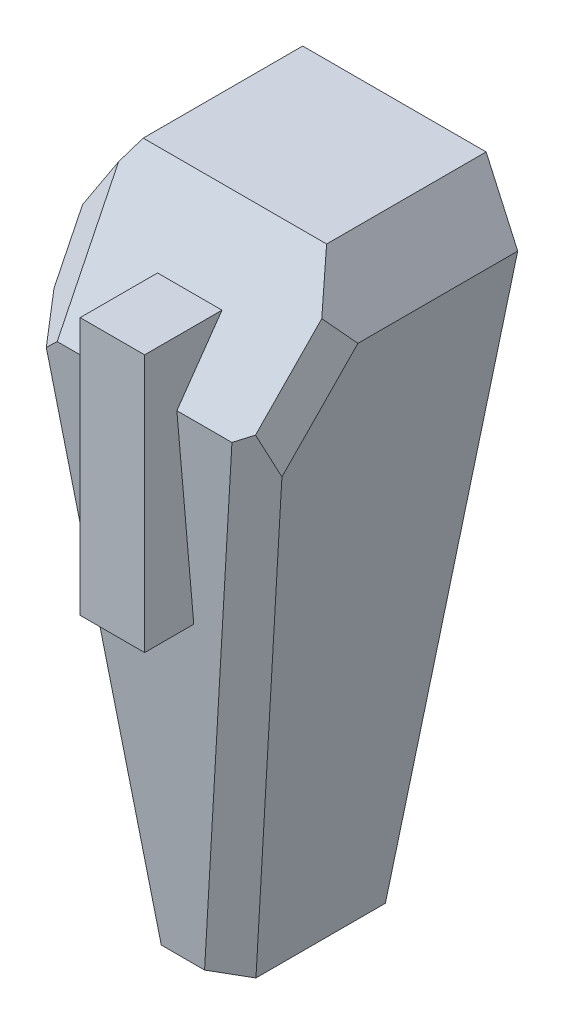
ISO-10303-21;
HEADER;
FILE_DESCRIPTION(('STEP AP214'),'2;1');
FILE_NAME('part.step','',(''),(''),'','','');
FILE_SCHEMA(('AUTOMOTIVE_DESIGN { 1 0 10303 214 1 1 1 1 }'));
ENDSEC;
DATA;
#1=APPLICATION_CONTEXT('core data for automotive mechanical design processes');
#2=APPLICATION_PROTOCOL_DEFINITION('international standard','automotive_design',2000,#1);
#3=PRODUCT_CONTEXT('',#1,'mechanical');
#4=PRODUCT('Part','Part','',(#3));
#5=PRODUCT_RELATED_PRODUCT_CATEGORY('part','',(#4));
#6=PRODUCT_DEFINITION_FORMATION('','',#4);
#7=PRODUCT_DEFINITION_CONTEXT('part definition',#1,'design');
#8=PRODUCT_DEFINITION('design','',#6,#7);
#9=PRODUCT_DEFINITION_SHAPE('','',#8);
#10=(LENGTH_UNIT() NAMED_UNIT(*) SI_UNIT(.MILLI.,.METRE.));
#11=(NAMED_UNIT(*) PLANE_ANGLE_UNIT() SI_UNIT($,.RADIAN.));
#12=(NAMED_UNIT(*) SI_UNIT($,.STERADIAN.) SOLID_ANGLE_UNIT());
#13=UNCERTAINTY_MEASURE_WITH_UNIT(LENGTH_MEASURE(1.E-05),#10,'distance_accuracy_value','');
#14=(GEOMETRIC_REPRESENTATION_CONTEXT(3) GLOBAL_UNCERTAINTY_ASSIGNED_CONTEXT((#13)) GLOBAL_UNIT_ASSIGNED_CONTEXT((#10,
#11,#12)) REPRESENTATION_CONTEXT('',''));
#15=CARTESIAN_POINT('',(0.,0.,0.));
#16=DIRECTION('',(0.,0.,1.));
#17=DIRECTION('',(1.,0.,0.));
#18=AXIS2_PLACEMENT_3D('',#15,#16,#17);
#19=CARTESIAN_POINT('',(-2.54063762490666,-7.57736723879216,12.5731601083553));
#20=DIRECTION('',(0.,1.,0.));
#21=DIRECTION('',(0.,0.,1.));
#22=AXIS2_PLACEMENT_3D('',#19,#20,#21);
#23=PLANE('',#22);
#24=DIRECTION('',(0.,0.,-1.));
#25=VECTOR('',#24,1.);
#26=CARTESIAN_POINT('',(2.27850759703834,-7.57736723879216,12.5731601083553));
#27=LINE('',#26,#25);
#28=CARTESIAN_POINT('',(2.27850759703834,-7.57736723879216,7.99436953583196));
#29=VERTEX_POINT('',#28);
#30=CARTESIAN_POINT('',(2.27850759703834,-7.57736723879216,1.14316010835564));
#31=VERTEX_POINT('',#30);
#32=EDGE_CURVE('E239',#29,#31,#27,.T.);
#33=ORIENTED_EDGE('',*,*,#32,.T.);
#34=DIRECTION('',(1.,0.,0.));
#35=VECTOR('',#34,1.);
#36=CARTESIAN_POINT('',(7.88021715314835,-7.57736723879216,1.14316010835564));
#37=LINE('',#36,#35);
#38=CARTESIAN_POINT('',(7.88021715314835,-7.57736723879216,1.14316010835564));
#39=VERTEX_POINT('',#38);
#40=EDGE_CURVE('E313',#31,#39,#37,.T.);
#41=ORIENTED_EDGE('',*,*,#40,.T.);
#42=DIRECTION('',(0.,0.,1.));
#43=VECTOR('',#42,1.);
#44=CARTESIAN_POINT('',(7.88021715314835,-7.57736723879216,12.5731601083553));
#45=LINE('',#44,#43);
#46=CARTESIAN_POINT('',(7.88021715314835,-7.57736723879216,8.79466521533705));
#47=VERTEX_POINT('',#46);
#48=EDGE_CURVE('E247',#39,#47,#45,.T.);
#49=ORIENTED_EDGE('',*,*,#48,.T.);
#50=DIRECTION('',(0.865779538833403,0.,-0.500425608994404));
#51=VECTOR('',#50,1.);
#52=CARTESIAN_POINT('',(10.1972262094942,-7.57736723879216,7.45542050457639));
#53=LINE('',#52,#51);
#54=CARTESIAN_POINT('',(5.95663715173307,-7.57736723879216,9.90650564408495));
#55=VERTEX_POINT('',#54);
#56=EDGE_CURVE('E309',#47,#55,#53,.F.);
#57=ORIENTED_EDGE('',*,*,#56,.T.);
#58=DIRECTION('',(-1.,0.,0.));
#59=VECTOR('',#58,1.);
#60=CARTESIAN_POINT('',(-2.54063762490666,-7.57736723879216,9.90650564408495));
#61=LINE('',#60,#59);
#62=CARTESIAN_POINT('',(3.39700225036011,-7.57736723879216,9.90650564408495));
#63=VERTEX_POINT('',#62);
#64=EDGE_CURVE('E267',#55,#63,#61,.T.);
#65=ORIENTED_EDGE('',*,*,#64,.T.);
#66=DIRECTION('',(0.504908682278094,0.,0.863172765186784));
#67=VECTOR('',#66,1.);
#68=CARTESIAN_POINT('',(2.2794048278375,-7.57736723879216,7.99590340763315));
#69=LINE('',#68,#67);
#70=EDGE_CURVE('E293',#63,#29,#69,.F.);
#71=ORIENTED_EDGE('',*,*,#70,.T.);
#72=EDGE_LOOP('',(#33,#41,#49,#57,#65,#71));
#73=FACE_BOUND('',#72,.T.);
#74=ADVANCED_FACE('F38',(#73),#23,.F.);
#75=CARTESIAN_POINT('',(-2.54063762490667,30.5226327612078,12.5731601083553));
#76=DIRECTION('',(0.,-1.,0.));
#77=DIRECTION('',(0.,0.,-1.));
#78=AXIS2_PLACEMENT_3D('',#75,#76,#77);
#79=PLANE('',#78);
#80=DIRECTION('',(0.,0.,-1.));
#81=VECTOR('',#80,1.);
#82=CARTESIAN_POINT('',(10.4996578494809,30.5226327612078,12.5731601083553));
#83=LINE('',#82,#81);
#84=CARTESIAN_POINT('',(10.4996578494809,30.5226327612078,7.23757866719735));
#85=VERTEX_POINT('',#84);
#86=CARTESIAN_POINT('',(10.4996578494809,30.5226327612078,-2.19015797198194));
#87=VERTEX_POINT('',#86);
#88=EDGE_CURVE('E254',#85,#87,#83,.T.);
#89=ORIENTED_EDGE('',*,*,#88,.T.);
#90=DIRECTION('',(-1.,0.,0.));
#91=VECTOR('',#90,1.);
#92=CARTESIAN_POINT('',(-2.54063762490666,30.5226327612078,-2.19015797198195));
#93=LINE('',#92,#91);
#94=CARTESIAN_POINT('',(-0.340933099294201,30.5226327612078,-2.19015797198194));
#95=VERTEX_POINT('',#94);
#96=EDGE_CURVE('E322',#87,#95,#93,.T.);
#97=ORIENTED_EDGE('',*,*,#96,.T.);
#98=DIRECTION('',(0.,0.,1.));
#99=VECTOR('',#98,1.);
#100=CARTESIAN_POINT('',(-0.340933099294201,30.5226327612078,12.5731601083553));
#101=LINE('',#100,#99);
#102=CARTESIAN_POINT('',(-0.340933099294201,30.5226327612078,7.23757866719735));
#103=VERTEX_POINT('',#102);
#104=EDGE_CURVE('E249',#95,#103,#101,.T.);
#105=ORIENTED_EDGE('',*,*,#104,.T.);
#106=DIRECTION('',(1.,0.,0.));
#107=VECTOR('',#106,1.);
#108=CARTESIAN_POINT('',(-2.54063762490667,30.5226327612078,7.23757866719735));
#109=LINE('',#108,#107);
#110=EDGE_CURVE('E236',#103,#85,#109,.T.);
#111=ORIENTED_EDGE('',*,*,#110,.T.);
#112=EDGE_LOOP('',(#89,#97,#105,#111));
#113=FACE_BOUND('',#112,.T.);
#114=ADVANCED_FACE('F373',(#113),#79,.F.);
#115=CARTESIAN_POINT('',(-2.54063762490666,22.9026327612078,12.5731601083553));
#116=DIRECTION('',(0.,-0.573576436351044,-0.819152044288994));
#117=DIRECTION('',(-1.,0.,0.));
#118=AXIS2_PLACEMENT_3D('',#115,#116,#117);
#119=PLANE('',#118);
#120=DIRECTION('',(0.776284712506677,0.516379080307432,-0.361572524605059));
#121=VECTOR('',#120,1.);
#122=CARTESIAN_POINT('',(2.53828616746802,17.7792933356468,16.1605609949401));
#123=LINE('',#122,#121);
#124=CARTESIAN_POINT('',(10.2403217934618,22.9026327612078,12.5731601083553));
#125=VERTEX_POINT('',#124);
#126=CARTESIAN_POINT('',(11.1912194604519,23.5351631393487,12.1302575694345));
#127=VERTEX_POINT('',#126);
#128=EDGE_CURVE('E295',#125,#127,#123,.T.);
#129=ORIENTED_EDGE('',*,*,#128,.T.);
#130=DIRECTION('',(-0.114368906493136,-0.813777054443474,0.56981282794341));
#131=VECTOR('',#130,1.);
#132=CARTESIAN_POINT('',(10.9238698199732,21.6328716021958,13.4622564436214));
#133=LINE('',#132,#131);
#134=CARTESIAN_POINT('',(11.8456079068349,28.1913788774204,8.869940210106));
#135=VERTEX_POINT('',#134);
#136=EDGE_CURVE('E299',#127,#135,#133,.F.);
#137=ORIENTED_EDGE('',*,*,#136,.T.);
#138=DIRECTION('',(-0.427535056636436,0.740512440111149,-0.518512392703889));
#139=VECTOR('',#138,1.);
#140=CARTESIAN_POINT('',(11.7113291514032,28.4239565042053,8.70708760261228));
#141=LINE('',#140,#139);
#142=EDGE_CURVE('E257',#135,#85,#141,.T.);
#143=ORIENTED_EDGE('',*,*,#142,.T.);
#144=ORIENTED_EDGE('',*,*,#110,.F.);
#145=DIRECTION('',(-0.427535056636435,-0.740512440111149,0.518512392703889));
#146=VECTOR('',#145,1.);
#147=CARTESIAN_POINT('',(-4.33826646493005,23.5990482771362,12.0855247143761));
#148=LINE('',#147,#146);
#149=CARTESIAN_POINT('',(-0.998458357425136,29.3837656068652,8.0350220336875));
#150=VERTEX_POINT('',#149);
#151=EDGE_CURVE('E251',#103,#150,#148,.T.);
#152=ORIENTED_EDGE('',*,*,#151,.T.);
#153=DIRECTION('',(-0.114368906493137,0.813777054443474,-0.56981282794341));
#154=VECTOR('',#153,1.);
#155=CARTESIAN_POINT('',(-0.119680946406349,23.1309394237868,12.413298062194));
#156=LINE('',#155,#154);
#157=CARTESIAN_POINT('',(-0.087594537479382,22.9026327612078,12.5731601083553));
#158=VERTEX_POINT('',#157);
#159=EDGE_CURVE('E278',#150,#158,#156,.F.);
#160=ORIENTED_EDGE('',*,*,#159,.T.);
#161=DIRECTION('',(-1.,0.,0.));
#162=VECTOR('',#161,1.);
#163=CARTESIAN_POINT('',(-2.54063762490666,22.9026327612078,12.5731601083553));
#164=LINE('',#163,#162);
#165=CARTESIAN_POINT('',(3.17436237509333,22.9026327612078,12.5731601083553));
#166=VERTEX_POINT('',#165);
#167=EDGE_CURVE('E227',#166,#158,#164,.T.);
#168=ORIENTED_EDGE('',*,*,#167,.F.);
#169=DIRECTION('',(0.,0.819152044288994,-0.573576436351044));
#170=VECTOR('',#169,1.);
#171=CARTESIAN_POINT('',(3.17436237509333,22.9026327612078,12.5731601083553));
#172=LINE('',#171,#170);
#173=CARTESIAN_POINT('',(3.17436237509333,26.7126327612078,9.90536938777633));
#174=VERTEX_POINT('',#173);
#175=EDGE_CURVE('E264',#174,#166,#172,.F.);
#176=ORIENTED_EDGE('',*,*,#175,.F.);
#177=DIRECTION('',(-1.,0.,0.));
#178=VECTOR('',#177,1.);
#179=CARTESIAN_POINT('',(-2.54063762490666,26.7126327612078,9.90536938777633));
#180=LINE('',#179,#178);
#181=CARTESIAN_POINT('',(6.98436237509333,26.7126327612078,9.90536938777633));
#182=VERTEX_POINT('',#181);
#183=EDGE_CURVE('E262',#174,#182,#180,.F.);
#184=ORIENTED_EDGE('',*,*,#183,.T.);
#185=DIRECTION('',(0.,-0.819152044288994,0.573576436351044));
#186=VECTOR('',#185,1.);
#187=CARTESIAN_POINT('',(6.98436237509333,22.9026327612078,12.5731601083553));
#188=LINE('',#187,#186);
#189=CARTESIAN_POINT('',(6.98436237509333,22.9026327612078,12.5731601083553));
#190=VERTEX_POINT('',#189);
#191=EDGE_CURVE('E259',#190,#182,#188,.F.);
#192=ORIENTED_EDGE('',*,*,#191,.F.);
#193=EDGE_CURVE('E234',#125,#190,#164,.T.);
#194=ORIENTED_EDGE('',*,*,#193,.F.);
#195=EDGE_LOOP('',(#129,#137,#143,#144,#152,#160,#168,#176,#184,#192,#194));
#196=FACE_BOUND('',#195,.T.);
#197=ADVANCED_FACE('F368',(#196),#119,.F.);
#198=CARTESIAN_POINT('',(2.27850759703834,-7.57736723879216,12.5731601083553));
#199=DIRECTION('',(0.990268068741571,0.139173100960062,0.));
#200=DIRECTION('',(0.,0.,-1.));
#201=AXIS2_PLACEMENT_3D('',#198,#199,#200);
#202=PLANE('',#201);
#203=DIRECTION('',(0.,0.,1.));
#204=VECTOR('',#203,1.);
#205=CARTESIAN_POINT('',(-2.54063762490667,26.7126327612087,12.5731601083553));
#206=LINE('',#205,#204);
#207=CARTESIAN_POINT('',(-2.54063762490667,26.7126327612087,-1.85682616394826));
#208=VERTEX_POINT('',#207);
#209=CARTESIAN_POINT('',(-2.54063762490667,26.7126327612087,8.62203318869436));
#210=VERTEX_POINT('',#209);
#211=EDGE_CURVE('E242',#208,#210,#206,.T.);
#212=ORIENTED_EDGE('',*,*,#211,.F.);
#213=DIRECTION('',(-0.138653705761118,0.986572379869053,-0.0863138989863305));
#214=VECTOR('',#213,1.);
#215=CARTESIAN_POINT('',(2.41529888756279,-8.55068784567572,1.22831462743412));
#216=LINE('',#215,#214);
#217=EDGE_CURVE('E11',#208,#31,#216,.F.);
#218=ORIENTED_EDGE('',*,*,#217,.T.);
#219=ORIENTED_EDGE('',*,*,#32,.F.);
#220=DIRECTION('',(0.138653705761118,-0.986572379869052,-0.0863138989863404));
#221=VECTOR('',#220,1.);
#222=CARTESIAN_POINT('',(2.22370981300887,-7.18746074545517,8.02848193383409));
#223=LINE('',#222,#221);
#224=CARTESIAN_POINT('',(-2.11736758706077,23.7009099495275,10.7308642044317));
#225=VERTEX_POINT('',#224);
#226=EDGE_CURVE('E286',#29,#225,#223,.F.);
#227=ORIENTED_EDGE('',*,*,#226,.T.);
#228=DIRECTION('',(0.114368906493136,-0.813777054443474,0.569812827943411));
#229=VECTOR('',#228,1.);
#230=CARTESIAN_POINT('',(0.971285912954412,1.72399835258292,26.1192633711805));
#231=LINE('',#230,#229);
#232=EDGE_CURVE('E288',#225,#210,#231,.F.);
#233=ORIENTED_EDGE('',*,*,#232,.T.);
#234=EDGE_LOOP('',(#212,#218,#219,#227,#233));
#235=FACE_BOUND('',#234,.T.);
#236=ADVANCED_FACE('F333',(#235),#202,.F.);
#237=CARTESIAN_POINT('',(12.6993623750933,26.7126327612087,12.5731601083553));
#238=DIRECTION('',(-0.990268068741571,0.139173100960062,0.));
#239=DIRECTION('',(0.,0.,-1.));
#240=AXIS2_PLACEMENT_3D('',#237,#238,#239);
#241=PLANE('',#240);
#242=ORIENTED_EDGE('',*,*,#48,.F.);
#243=DIRECTION('',(-0.138653705761118,-0.986572379869053,0.0863138989863305));
#244=VECTOR('',#243,1.);
#245=CARTESIAN_POINT('',(12.526668022999,25.4838485970897,-1.74932147966767));
#246=LINE('',#245,#244);
#247=CARTESIAN_POINT('',(12.6993623750933,26.7126327612087,-1.85682616394826));
#248=VERTEX_POINT('',#247);
#249=EDGE_CURVE('E318',#39,#248,#246,.F.);
#250=ORIENTED_EDGE('',*,*,#249,.T.);
#251=DIRECTION('',(0.,0.,-1.));
#252=VECTOR('',#251,1.);
#253=CARTESIAN_POINT('',(12.6993623750933,26.7126327612087,12.5731601083553));
#254=LINE('',#253,#252);
#255=CARTESIAN_POINT('',(12.6993623750933,26.7126327612087,7.58721521931884));
#256=VERTEX_POINT('',#255);
#257=EDGE_CURVE('E244',#256,#248,#254,.T.);
#258=ORIENTED_EDGE('',*,*,#257,.F.);
#259=DIRECTION('',(0.114368906493136,0.813777054443475,-0.569812827943411));
#260=VECTOR('',#259,1.);
#261=CARTESIAN_POINT('',(12.3744339806048,24.4006471011222,9.20608500674412));
#262=LINE('',#261,#260);
#263=CARTESIAN_POINT('',(11.9486711773902,21.3711873422113,11.3273355666365));
#264=VERTEX_POINT('',#263);
#265=EDGE_CURVE('E307',#256,#264,#262,.F.);
#266=ORIENTED_EDGE('',*,*,#265,.T.);
#267=DIRECTION('',(0.138653705761118,0.986572379869052,0.0863138989863404));
#268=VECTOR('',#267,1.);
#269=CARTESIAN_POINT('',(12.7086793653743,26.7789265917579,11.8004514462761));
#270=LINE('',#269,#268);
#271=EDGE_CURVE('E304',#264,#47,#270,.F.);
#272=ORIENTED_EDGE('',*,*,#271,.T.);
#273=EDGE_LOOP('',(#242,#250,#258,#266,#272));
#274=FACE_BOUND('',#273,.T.);
#275=ADVANCED_FACE('F342',(#274),#241,.F.);
#276=CARTESIAN_POINT('',(-2.54063762490667,26.7126327612078,12.5731601083553));
#277=DIRECTION('',(0.86602540378444,-0.499999999999997,0.));
#278=DIRECTION('',(0.,0.,-1.));
#279=AXIS2_PLACEMENT_3D('',#276,#277,#278);
#280=PLANE('',#279);
#281=ORIENTED_EDGE('',*,*,#104,.F.);
#282=DIRECTION('',(0.498570974847155,0.863550259614425,-0.075550858101128));
#283=VECTOR('',#282,1.);
#284=CARTESIAN_POINT('',(-3.08417862739423,25.7711921289024,-1.77446078123879));
#285=LINE('',#284,#283);
#286=EDGE_CURVE('E46',#95,#208,#285,.F.);
#287=ORIENTED_EDGE('',*,*,#286,.T.);
#288=ORIENTED_EDGE('',*,*,#211,.T.);
#289=DIRECTION('',(0.491183494867127,0.850754768949119,-0.186962823792449));
#290=VECTOR('',#289,1.);
#291=CARTESIAN_POINT('',(-2.90348167352217,26.0841684337818,8.76014521532923));
#292=LINE('',#291,#290);
#293=EDGE_CURVE('E291',#210,#150,#292,.T.);
#294=ORIENTED_EDGE('',*,*,#293,.T.);
#295=ORIENTED_EDGE('',*,*,#151,.F.);
#296=EDGE_LOOP('',(#281,#287,#288,#294,#295));
#297=FACE_BOUND('',#296,.T.);
#298=ADVANCED_FACE('F327',(#297),#280,.F.);
#299=CARTESIAN_POINT('',(10.4996578494809,30.5226327612078,12.5731601083553));
#300=DIRECTION('',(-0.86602540378444,-0.499999999999998,0.));
#301=DIRECTION('',(0.,0.,-1.));
#302=AXIS2_PLACEMENT_3D('',#299,#300,#301);
#303=PLANE('',#302);
#304=ORIENTED_EDGE('',*,*,#257,.T.);
#305=DIRECTION('',(0.498570974847156,-0.863550259614424,0.0755508581011279));
#306=VECTOR('',#305,1.);
#307=CARTESIAN_POINT('',(11.0557546161723,29.5594449073736,-2.10588995392558));
#308=LINE('',#307,#306);
#309=EDGE_CURVE('E320',#248,#87,#308,.F.);
#310=ORIENTED_EDGE('',*,*,#309,.T.);
#311=ORIENTED_EDGE('',*,*,#88,.F.);
#312=ORIENTED_EDGE('',*,*,#142,.F.);
#313=DIRECTION('',(0.399764636744095,-0.692412661910092,-0.600627122960196));
#314=VECTOR('',#313,1.);
#315=CARTESIAN_POINT('',(10.0960350733563,31.2217279165476,11.4985891720057));
#316=LINE('',#315,#314);
#317=EDGE_CURVE('E302',#135,#256,#316,.T.);
#318=ORIENTED_EDGE('',*,*,#317,.T.);
#319=EDGE_LOOP('',(#304,#310,#311,#312,#318));
#320=FACE_BOUND('',#319,.T.);
#321=ADVANCED_FACE('F375',(#320),#303,.F.);
#322=CARTESIAN_POINT('',(-2.54063762490666,11.4726327612078,14.4781601083553));
#323=DIRECTION('',(0.,-1.,0.));
#324=DIRECTION('',(0.,0.,-1.));
#325=AXIS2_PLACEMENT_3D('',#322,#323,#324);
#326=PLANE('',#325);
#327=DIRECTION('',(0.,0.,-1.));
#328=VECTOR('',#327,1.);
#329=CARTESIAN_POINT('',(3.17436237509333,11.4726327612078,14.4781601083553));
#330=LINE('',#329,#328);
#331=CARTESIAN_POINT('',(3.17436237509333,11.4726327612078,14.4781601083553));
#332=VERTEX_POINT('',#331);
#333=CARTESIAN_POINT('',(3.17436237509333,11.4726327612078,11.5731646842539));
#334=VERTEX_POINT('',#333);
#335=EDGE_CURVE('E228',#332,#334,#330,.T.);
#336=ORIENTED_EDGE('',*,*,#335,.T.);
#337=DIRECTION('',(-1.,0.,0.));
#338=VECTOR('',#337,1.);
#339=CARTESIAN_POINT('',(-2.54063762490666,11.4726327612078,11.5731646842539));
#340=LINE('',#339,#338);
#341=CARTESIAN_POINT('',(6.98436237509333,11.4726327612078,11.5731646842539));
#342=VERTEX_POINT('',#341);
#343=EDGE_CURVE('E272',#334,#342,#340,.F.);
#344=ORIENTED_EDGE('',*,*,#343,.T.);
#345=DIRECTION('',(0.,0.,-1.));
#346=VECTOR('',#345,1.);
#347=CARTESIAN_POINT('',(6.98436237509333,11.4726327612078,14.4781601083553));
#348=LINE('',#347,#346);
#349=CARTESIAN_POINT('',(6.98436237509333,11.4726327612078,14.4781601083553));
#350=VERTEX_POINT('',#349);
#351=EDGE_CURVE('E230',#350,#342,#348,.T.);
#352=ORIENTED_EDGE('',*,*,#351,.F.);
#353=DIRECTION('',(-1.,0.,0.));
#354=VECTOR('',#353,1.);
#355=CARTESIAN_POINT('',(-2.54063762490666,11.4726327612078,14.4781601083553));
#356=LINE('',#355,#354);
#357=EDGE_CURVE('E217',#350,#332,#356,.T.);
#358=ORIENTED_EDGE('',*,*,#357,.T.);
#359=EDGE_LOOP('',(#336,#344,#352,#358));
#360=FACE_BOUND('',#359,.T.);
#361=ADVANCED_FACE('F387',(#360),#326,.T.);
#362=CARTESIAN_POINT('',(3.17436237509333,-7.57736723879216,14.4781601083553));
#363=DIRECTION('',(-1.,0.,0.));
#364=DIRECTION('',(0.,0.,1.));
#365=AXIS2_PLACEMENT_3D('',#362,#363,#364);
#366=PLANE('',#365);
#367=ORIENTED_EDGE('',*,*,#175,.T.);
#368=DIRECTION('',(0.,0.996194698091745,0.087155742747665));
#369=VECTOR('',#368,1.);
#370=CARTESIAN_POINT('',(3.17436237509333,22.9026327612079,12.5731601083553));
#371=LINE('',#370,#369);
#372=EDGE_CURVE('E269',#166,#334,#371,.F.);
#373=ORIENTED_EDGE('',*,*,#372,.T.);
#374=ORIENTED_EDGE('',*,*,#335,.F.);
#375=DIRECTION('',(0.,1.,0.));
#376=VECTOR('',#375,1.);
#377=CARTESIAN_POINT('',(3.17436237509333,-7.57736723879216,14.4781601083553));
#378=LINE('',#377,#376);
#379=CARTESIAN_POINT('',(3.17436237509333,26.7126327612078,14.4781601083553));
#380=VERTEX_POINT('',#379);
#381=EDGE_CURVE('E220',#332,#380,#378,.T.);
#382=ORIENTED_EDGE('',*,*,#381,.T.);
#383=DIRECTION('',(0.,0.,-1.));
#384=VECTOR('',#383,1.);
#385=CARTESIAN_POINT('',(3.17436237509333,26.7126327612078,14.4781601083553));
#386=LINE('',#385,#384);
#387=EDGE_CURVE('E224',#380,#174,#386,.T.);
#388=ORIENTED_EDGE('',*,*,#387,.T.);
#389=EDGE_LOOP('',(#367,#373,#374,#382,#388));
#390=FACE_BOUND('',#389,.T.);
#391=ADVANCED_FACE('F390',(#390),#366,.T.);
#392=CARTESIAN_POINT('',(6.98436237509333,-7.57736723879216,14.4781601083553));
#393=DIRECTION('',(1.,0.,0.));
#394=DIRECTION('',(0.,0.,-1.));
#395=AXIS2_PLACEMENT_3D('',#392,#393,#394);
#396=PLANE('',#395);
#397=ORIENTED_EDGE('',*,*,#351,.T.);
#398=DIRECTION('',(0.,-0.996194698091745,-0.087155742747665));
#399=VECTOR('',#398,1.);
#400=CARTESIAN_POINT('',(6.98436237509333,22.9026327612079,12.5731601083553));
#401=LINE('',#400,#399);
#402=EDGE_CURVE('E275',#342,#190,#401,.F.);
#403=ORIENTED_EDGE('',*,*,#402,.T.);
#404=ORIENTED_EDGE('',*,*,#191,.T.);
#405=DIRECTION('',(0.,0.,-1.));
#406=VECTOR('',#405,1.);
#407=CARTESIAN_POINT('',(6.98436237509333,26.7126327612078,14.4781601083553));
#408=LINE('',#407,#406);
#409=CARTESIAN_POINT('',(6.98436237509333,26.7126327612078,14.4781601083553));
#410=VERTEX_POINT('',#409);
#411=EDGE_CURVE('E223',#410,#182,#408,.T.);
#412=ORIENTED_EDGE('',*,*,#411,.F.);
#413=DIRECTION('',(0.,-1.,0.));
#414=VECTOR('',#413,1.);
#415=CARTESIAN_POINT('',(6.98436237509333,-7.57736723879216,14.4781601083553));
#416=LINE('',#415,#414);
#417=EDGE_CURVE('E213',#410,#350,#416,.T.);
#418=ORIENTED_EDGE('',*,*,#417,.T.);
#419=EDGE_LOOP('',(#397,#403,#404,#412,#418));
#420=FACE_BOUND('',#419,.T.);
#421=ADVANCED_FACE('F383',(#420),#396,.T.);
#422=CARTESIAN_POINT('',(-2.54063762490666,26.7126327612078,14.4781601083553));
#423=DIRECTION('',(0.,-1.,0.));
#424=DIRECTION('',(0.,0.,-1.));
#425=AXIS2_PLACEMENT_3D('',#422,#423,#424);
#426=PLANE('',#425);
#427=ORIENTED_EDGE('',*,*,#183,.F.);
#428=ORIENTED_EDGE('',*,*,#387,.F.);
#429=DIRECTION('',(-1.,0.,0.));
#430=VECTOR('',#429,1.);
#431=CARTESIAN_POINT('',(-2.54063762490666,26.7126327612078,14.4781601083553));
#432=LINE('',#431,#430);
#433=EDGE_CURVE('E211',#410,#380,#432,.T.);
#434=ORIENTED_EDGE('',*,*,#433,.F.);
#435=ORIENTED_EDGE('',*,*,#411,.T.);
#436=EDGE_LOOP('',(#427,#428,#434,#435));
#437=FACE_BOUND('',#436,.T.);
#438=ADVANCED_FACE('F395',(#437),#426,.F.);
#439=CARTESIAN_POINT('',(-2.54063762490666,-7.57736723879216,14.4781601083553));
#440=DIRECTION('',(0.,0.,-1.));
#441=DIRECTION('',(-1.,0.,0.));
#442=AXIS2_PLACEMENT_3D('',#439,#440,#441);
#443=PLANE('',#442);
#444=ORIENTED_EDGE('',*,*,#433,.T.);
#445=ORIENTED_EDGE('',*,*,#381,.F.);
#446=ORIENTED_EDGE('',*,*,#357,.F.);
#447=ORIENTED_EDGE('',*,*,#417,.F.);
#448=EDGE_LOOP('',(#444,#445,#446,#447));
#449=FACE_BOUND('',#448,.T.);
#450=ADVANCED_FACE('F397',(#449),#443,.F.);
#451=CARTESIAN_POINT('',(-2.54063762490666,22.9026327612079,12.5731601083553));
#452=DIRECTION('',(0.,0.087155742747665,-0.996194698091745));
#453=DIRECTION('',(1.,0.,0.));
#454=AXIS2_PLACEMENT_3D('',#451,#452,#453);
#455=PLANE('',#454);
#456=ORIENTED_EDGE('',*,*,#64,.F.);
#457=DIRECTION('',(-0.138653705761118,-0.986572379869052,-0.0863138989863404));
#458=VECTOR('',#457,1.);
#459=CARTESIAN_POINT('',(9.99460976423742,21.1543008280387,12.4202008841227));
#460=LINE('',#459,#458);
#461=EDGE_CURVE('E311',#55,#125,#460,.F.);
#462=ORIENTED_EDGE('',*,*,#461,.T.);
#463=ORIENTED_EDGE('',*,*,#193,.T.);
#464=ORIENTED_EDGE('',*,*,#402,.F.);
#465=ORIENTED_EDGE('',*,*,#343,.F.);
#466=ORIENTED_EDGE('',*,*,#372,.F.);
#467=ORIENTED_EDGE('',*,*,#167,.T.);
#468=DIRECTION('',(-0.718323074090606,-0.693062296333456,-0.0606350940464268));
#469=VECTOR('',#468,1.);
#470=CARTESIAN_POINT('',(-1.35333542918166,21.6814033163972,12.4663163763703));
#471=LINE('',#470,#469);
#472=CARTESIAN_POINT('',(-0.791265625525082,22.2237071945165,12.5137618178919));
#473=VERTEX_POINT('',#472);
#474=EDGE_CURVE('E284',#158,#473,#471,.T.);
#475=ORIENTED_EDGE('',*,*,#474,.T.);
#476=DIRECTION('',(-0.138653705761118,0.986572379869052,0.0863138989863404));
#477=VECTOR('',#476,1.);
#478=CARTESIAN_POINT('',(-0.918479432840772,23.1288804673598,12.5929542177924));
#479=LINE('',#478,#477);
#480=EDGE_CURVE('E281',#473,#63,#479,.F.);
#481=ORIENTED_EDGE('',*,*,#480,.T.);
#482=EDGE_LOOP('',(#456,#462,#463,#464,#465,#466,#467,#475,#481));
#483=FACE_BOUND('',#482,.T.);
#484=ADVANCED_FACE('F354',(#483),#455,.F.);
#485=CARTESIAN_POINT('',(2.22370981300887,-7.18746074545517,8.02848193383409));
#486=DIRECTION('',(0.851591017597816,0.163264389982249,-0.498133995738537));
#487=DIRECTION('',(-0.138653705761118,0.986572379869052,0.0863138989863404));
#488=AXIS2_PLACEMENT_3D('',#485,#486,#487);
#489=PLANE('',#488);
#490=ORIENTED_EDGE('',*,*,#70,.F.);
#491=ORIENTED_EDGE('',*,*,#480,.F.);
#492=DIRECTION('',(-0.496998722522401,0.553628531924381,-0.668197364893305));
#493=VECTOR('',#492,1.);
#494=CARTESIAN_POINT('',(6.55648697793582,14.0387254180004,22.3925576880346));
#495=LINE('',#494,#493);
#496=EDGE_CURVE('E214',#225,#473,#495,.F.);
#497=ORIENTED_EDGE('',*,*,#496,.F.);
#498=ORIENTED_EDGE('',*,*,#226,.F.);
#499=EDGE_LOOP('',(#490,#491,#497,#498));
#500=FACE_BOUND('',#499,.T.);
#501=ADVANCED_FACE('F362',(#500),#489,.F.);
#502=CARTESIAN_POINT('',(-0.119680946406351,23.1309394237868,12.413298062194));
#503=DIRECTION('',(0.496719174490867,-0.449889003113678,-0.742206134824074));
#504=DIRECTION('',(0.114368906493136,-0.813777054443474,0.56981282794341));
#505=AXIS2_PLACEMENT_3D('',#502,#503,#504);
#506=PLANE('',#505);
#507=ORIENTED_EDGE('',*,*,#293,.F.);
#508=ORIENTED_EDGE('',*,*,#232,.F.);
#509=ORIENTED_EDGE('',*,*,#496,.T.);
#510=ORIENTED_EDGE('',*,*,#474,.F.);
#511=ORIENTED_EDGE('',*,*,#159,.F.);
#512=EDGE_LOOP('',(#507,#508,#509,#510,#511));
#513=FACE_BOUND('',#512,.T.);
#514=ADVANCED_FACE('F364',(#513),#506,.F.);
#515=CARTESIAN_POINT('',(12.7086793653743,26.7789265917579,11.8004514462761));
#516=DIRECTION('',(-0.495170463042449,0.144542130580178,-0.856687682307659));
#517=DIRECTION('',(-0.138653705761118,-0.986572379869052,-0.0863138989863404));
#518=AXIS2_PLACEMENT_3D('',#515,#516,#517);
#519=PLANE('',#518);
#520=ORIENTED_EDGE('',*,*,#56,.F.);
#521=ORIENTED_EDGE('',*,*,#271,.F.);
#522=DIRECTION('',(-0.311806015510691,0.890803540183896,0.330523919689914));
#523=VECTOR('',#522,1.);
#524=CARTESIAN_POINT('',(10.4717601224585,25.5905979078321,12.8929064877423));
#525=LINE('',#524,#523);
#526=EDGE_CURVE('E182',#127,#264,#525,.F.);
#527=ORIENTED_EDGE('',*,*,#526,.F.);
#528=ORIENTED_EDGE('',*,*,#128,.F.);
#529=ORIENTED_EDGE('',*,*,#461,.F.);
#530=EDGE_LOOP('',(#520,#521,#527,#528,#529));
#531=FACE_BOUND('',#530,.T.);
#532=ADVANCED_FACE('F350',(#531),#519,.F.);
#533=CARTESIAN_POINT('',(10.9238698199732,21.6328716021958,13.4622564436214));
#534=DIRECTION('',(-0.89724861320261,-0.161606283380976,-0.41088725373));
#535=DIRECTION('',(0.114368906493136,0.813777054443474,-0.56981282794341));
#536=AXIS2_PLACEMENT_3D('',#533,#534,#535);
#537=PLANE('',#536);
#538=ORIENTED_EDGE('',*,*,#526,.T.);
#539=ORIENTED_EDGE('',*,*,#265,.F.);
#540=ORIENTED_EDGE('',*,*,#317,.F.);
#541=ORIENTED_EDGE('',*,*,#136,.F.);
#542=EDGE_LOOP('',(#538,#539,#540,#541));
#543=FACE_BOUND('',#542,.T.);
#544=ADVANCED_FACE('F377',(#543),#537,.F.);
#545=CARTESIAN_POINT('',(-2.54063762490666,-7.57736723879216,1.14316010835564));
#546=DIRECTION('',(0.,-0.087155742747655,-0.996194698091746));
#547=DIRECTION('',(-1.,0.,0.));
#548=AXIS2_PLACEMENT_3D('',#545,#546,#547);
#549=PLANE('',#548);
#550=DIRECTION('',(-1.,0.,0.));
#551=VECTOR('',#550,1.);
#552=CARTESIAN_POINT('',(0.,26.7271309614783,-1.85809459211338));
#553=LINE('',#552,#551);
#554=CARTESIAN_POINT('',(8.03107732509333,26.7271309614783,-1.85809459211338));
#555=VERTEX_POINT('',#554);
#556=CARTESIAN_POINT('',(2.12764742509333,26.7271309614783,-1.85809459211338));
#557=VERTEX_POINT('',#556);
#558=EDGE_CURVE('E179',#555,#557,#553,.T.);
#559=ORIENTED_EDGE('',*,*,#558,.T.);
#560=DIRECTION('',(0.,-0.996194698091746,0.087155742747655));
#561=VECTOR('',#560,1.);
#562=CARTESIAN_POINT('',(2.12764742509333,0.0416952174942771,0.476578516734618));
#563=LINE('',#562,#561);
#564=CARTESIAN_POINT('',(2.12764742509333,17.6731079245929,-1.06597021708338));
#565=VERTEX_POINT('',#564);
#566=EDGE_CURVE('E193',#557,#565,#563,.T.);
#567=ORIENTED_EDGE('',*,*,#566,.T.);
#568=DIRECTION('',(1.,0.,0.));
#569=VECTOR('',#568,1.);
#570=CARTESIAN_POINT('',(0.,17.6731079245929,-1.06597021708338));
#571=LINE('',#570,#569);
#572=CARTESIAN_POINT('',(8.03107732509333,17.6731079245929,-1.06597021708338));
#573=VERTEX_POINT('',#572);
#574=EDGE_CURVE('E58',#565,#573,#571,.T.);
#575=ORIENTED_EDGE('',*,*,#574,.T.);
#576=DIRECTION('',(0.,0.996194698091746,-0.087155742747655));
#577=VECTOR('',#576,1.);
#578=CARTESIAN_POINT('',(8.03107732509333,0.0416952174942774,0.476578516734618));
#579=LINE('',#578,#577);
#580=EDGE_CURVE('E53',#573,#555,#579,.T.);
#581=ORIENTED_EDGE('',*,*,#580,.T.);
#582=EDGE_LOOP('',(#559,#567,#575,#581));
#583=FACE_BOUND('',#582,.T.);
#584=ORIENTED_EDGE('',*,*,#286,.F.);
#585=ORIENTED_EDGE('',*,*,#96,.F.);
#586=ORIENTED_EDGE('',*,*,#309,.F.);
#587=ORIENTED_EDGE('',*,*,#249,.F.);
#588=ORIENTED_EDGE('',*,*,#40,.F.);
#589=ORIENTED_EDGE('',*,*,#217,.F.);
#590=EDGE_LOOP('',(#584,#585,#586,#587,#588,#589));
#591=FACE_BOUND('',#590,.T.);
#592=ADVANCED_FACE('F40',(#583,#591),#549,.T.);
#593=CARTESIAN_POINT('',(0.,26.7049934028204,-2.11112804542868));
#594=DIRECTION('',(0.,0.996194698091746,-0.087155742747655));
#595=DIRECTION('',(0.,0.087155742747655,0.996194698091746));
#596=AXIS2_PLACEMENT_3D('',#593,#594,#595);
#597=PLANE('',#596);
#598=ORIENTED_EDGE('',*,*,#558,.F.);
#599=DIRECTION('',(0.,0.087155742747655,0.996194698091746));
#600=VECTOR('',#599,1.);
#601=CARTESIAN_POINT('',(8.03107732509333,26.7049934028204,-2.11112804542868));
#602=LINE('',#601,#600);
#603=CARTESIAN_POINT('',(8.03107732509333,26.7049934028204,-2.11112804542868));
#604=VERTEX_POINT('',#603);
#605=EDGE_CURVE('E173',#604,#555,#602,.T.);
#606=ORIENTED_EDGE('',*,*,#605,.F.);
#607=DIRECTION('',(-1.,0.,0.));
#608=VECTOR('',#607,1.);
#609=CARTESIAN_POINT('',(0.,26.7049934028204,-2.11112804542868));
#610=LINE('',#609,#608);
#611=CARTESIAN_POINT('',(2.12764742509333,26.7049934028204,-2.11112804542868));
#612=VERTEX_POINT('',#611);
#613=EDGE_CURVE('E177',#604,#612,#610,.T.);
#614=ORIENTED_EDGE('',*,*,#613,.T.);
#615=DIRECTION('',(0.,0.087155742747655,0.996194698091746));
#616=VECTOR('',#615,1.);
#617=CARTESIAN_POINT('',(2.12764742509333,26.7049934028204,-2.11112804542868));
#618=LINE('',#617,#616);
#619=EDGE_CURVE('E201',#612,#557,#618,.T.);
#620=ORIENTED_EDGE('',*,*,#619,.T.);
#621=EDGE_LOOP('',(#598,#606,#614,#620));
#622=FACE_BOUND('',#621,.T.);
#623=ADVANCED_FACE('F175',(#622),#597,.T.);
#624=CARTESIAN_POINT('',(8.03107732509333,0.019557658836373,0.223545063419314));
#625=DIRECTION('',(1.,0.,0.));
#626=DIRECTION('',(0.,0.,-1.));
#627=AXIS2_PLACEMENT_3D('',#624,#625,#626);
#628=PLANE('',#627);
#629=ORIENTED_EDGE('',*,*,#580,.F.);
#630=DIRECTION('',(0.,0.087155742747655,0.996194698091746));
#631=VECTOR('',#630,1.);
#632=CARTESIAN_POINT('',(8.03107732509333,17.650970365935,-1.31900367039868));
#633=LINE('',#632,#631);
#634=CARTESIAN_POINT('',(8.03107732509333,17.650970365935,-1.31900367039868));
#635=VERTEX_POINT('',#634);
#636=EDGE_CURVE('E183',#635,#573,#633,.T.);
#637=ORIENTED_EDGE('',*,*,#636,.F.);
#638=DIRECTION('',(0.,0.996194698091746,-0.087155742747655));
#639=VECTOR('',#638,1.);
#640=CARTESIAN_POINT('',(8.03107732509333,0.019557658836373,0.223545063419314));
#641=LINE('',#640,#639);
#642=EDGE_CURVE('E189',#635,#604,#641,.T.);
#643=ORIENTED_EDGE('',*,*,#642,.T.);
#644=ORIENTED_EDGE('',*,*,#605,.T.);
#645=EDGE_LOOP('',(#629,#637,#643,#644));
#646=FACE_BOUND('',#645,.T.);
#647=ADVANCED_FACE('F195',(#646),#628,.T.);
#648=CARTESIAN_POINT('',(0.,17.650970365935,-1.31900367039868));
#649=DIRECTION('',(0.,-0.996194698091746,0.087155742747655));
#650=DIRECTION('',(0.,-0.087155742747655,-0.996194698091746));
#651=AXIS2_PLACEMENT_3D('',#648,#649,#650);
#652=PLANE('',#651);
#653=ORIENTED_EDGE('',*,*,#574,.F.);
#654=DIRECTION('',(0.,0.087155742747655,0.996194698091746));
#655=VECTOR('',#654,1.);
#656=CARTESIAN_POINT('',(2.12764742509333,17.650970365935,-1.31900367039868));
#657=LINE('',#656,#655);
#658=CARTESIAN_POINT('',(2.12764742509333,17.650970365935,-1.31900367039868));
#659=VERTEX_POINT('',#658);
#660=EDGE_CURVE('E207',#659,#565,#657,.T.);
#661=ORIENTED_EDGE('',*,*,#660,.F.);
#662=DIRECTION('',(1.,0.,0.));
#663=VECTOR('',#662,1.);
#664=CARTESIAN_POINT('',(0.,17.650970365935,-1.31900367039868));
#665=LINE('',#664,#663);
#666=EDGE_CURVE('E196',#659,#635,#665,.T.);
#667=ORIENTED_EDGE('',*,*,#666,.T.);
#668=ORIENTED_EDGE('',*,*,#636,.T.);
#669=EDGE_LOOP('',(#653,#661,#667,#668));
#670=FACE_BOUND('',#669,.T.);
#671=ADVANCED_FACE('F455',(#670),#652,.T.);
#672=CARTESIAN_POINT('',(2.12764742509333,0.0195576588363727,0.223545063419314));
#673=DIRECTION('',(-1.,0.,0.));
#674=DIRECTION('',(0.,-1.,0.));
#675=AXIS2_PLACEMENT_3D('',#672,#673,#674);
#676=PLANE('',#675);
#677=ORIENTED_EDGE('',*,*,#566,.F.);
#678=ORIENTED_EDGE('',*,*,#619,.F.);
#679=DIRECTION('',(0.,-0.996194698091746,0.087155742747655));
#680=VECTOR('',#679,1.);
#681=CARTESIAN_POINT('',(2.12764742509333,0.0195576588363727,0.223545063419314));
#682=LINE('',#681,#680);
#683=EDGE_CURVE('E192',#612,#659,#682,.T.);
#684=ORIENTED_EDGE('',*,*,#683,.T.);
#685=ORIENTED_EDGE('',*,*,#660,.T.);
#686=EDGE_LOOP('',(#677,#678,#684,#685));
#687=FACE_BOUND('',#686,.T.);
#688=ADVANCED_FACE('F462',(#687),#676,.T.);
#689=CARTESIAN_POINT('',(0.,0.019557658836373,0.223545063419314));
#690=DIRECTION('',(0.,-0.087155742747655,-0.996194698091746));
#691=DIRECTION('',(0.,0.996194698091746,-0.087155742747655));
#692=AXIS2_PLACEMENT_3D('',#689,#690,#691);
#693=PLANE('',#692);
#694=ORIENTED_EDGE('',*,*,#613,.F.);
#695=ORIENTED_EDGE('',*,*,#642,.F.);
#696=ORIENTED_EDGE('',*,*,#666,.F.);
#697=ORIENTED_EDGE('',*,*,#683,.F.);
#698=EDGE_LOOP('',(#694,#695,#696,#697));
#699=FACE_BOUND('',#698,.T.);
#700=ADVANCED_FACE('F187',(#699),#693,.T.);
#701=CLOSED_SHELL('',(#74,#114,#197,#236,#275,#298,#321,#361,#391,#421,#438,#450,#484,#501,#514,
#532,#544,#592,#623,#647,#671,#688,#700));
#702=MANIFOLD_SOLID_BREP('B2',#701);
#703=ADVANCED_BREP_SHAPE_REPRESENTATION('',(#18,#702),#14);
#704=SHAPE_DEFINITION_REPRESENTATION(#9,#703);
ENDSEC;
END-ISO-10303-21;
